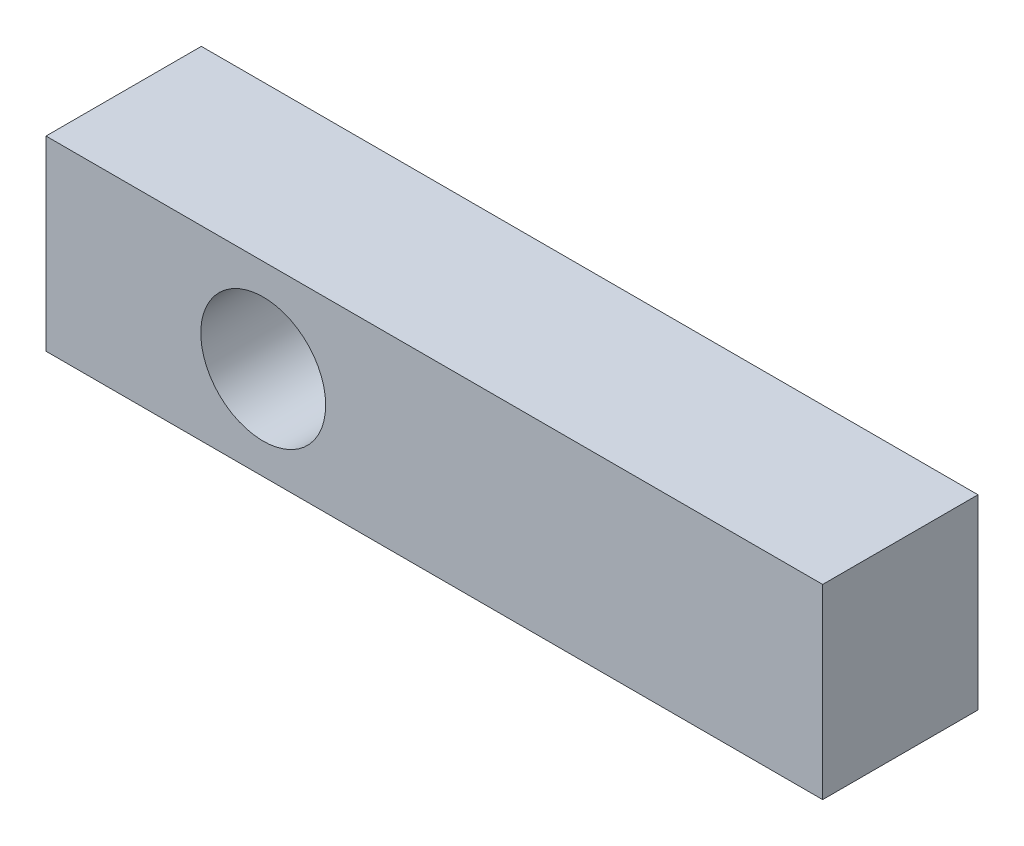
ISO-10303-21;
HEADER;
FILE_DESCRIPTION(('STEP AP214'),'2;1');
FILE_NAME('part.step','',(''),(''),'','','');
FILE_SCHEMA(('AUTOMOTIVE_DESIGN { 1 0 10303 214 1 1 1 1 }'));
ENDSEC;
DATA;
#1=APPLICATION_CONTEXT('core data for automotive mechanical design processes');
#2=APPLICATION_PROTOCOL_DEFINITION('international standard','automotive_design',2000,#1);
#3=PRODUCT_CONTEXT('',#1,'mechanical');
#4=PRODUCT('Part','Part','',(#3));
#5=PRODUCT_RELATED_PRODUCT_CATEGORY('part','',(#4));
#6=PRODUCT_DEFINITION_FORMATION('','',#4);
#7=PRODUCT_DEFINITION_CONTEXT('part definition',#1,'design');
#8=PRODUCT_DEFINITION('design','',#6,#7);
#9=PRODUCT_DEFINITION_SHAPE('','',#8);
#10=(LENGTH_UNIT() NAMED_UNIT(*) SI_UNIT(.MILLI.,.METRE.));
#11=(NAMED_UNIT(*) PLANE_ANGLE_UNIT() SI_UNIT($,.RADIAN.));
#12=(NAMED_UNIT(*) SI_UNIT($,.STERADIAN.) SOLID_ANGLE_UNIT());
#13=UNCERTAINTY_MEASURE_WITH_UNIT(LENGTH_MEASURE(1.E-05),#10,'distance_accuracy_value','');
#14=(GEOMETRIC_REPRESENTATION_CONTEXT(3) GLOBAL_UNCERTAINTY_ASSIGNED_CONTEXT((#13)) GLOBAL_UNIT_ASSIGNED_CONTEXT((#10,
#11,#12)) REPRESENTATION_CONTEXT('',''));
#15=CARTESIAN_POINT('',(0.,0.,0.));
#16=DIRECTION('',(0.,0.,1.));
#17=DIRECTION('',(1.,0.,0.));
#18=AXIS2_PLACEMENT_3D('',#15,#16,#17);
#19=CARTESIAN_POINT('',(12.5,-3.,5.));
#20=DIRECTION('',(-1.,0.,0.));
#21=DIRECTION('',(0.,0.,1.));
#22=AXIS2_PLACEMENT_3D('',#19,#20,#21);
#23=PLANE('',#22);
#24=DIRECTION('',(0.,1.,0.));
#25=VECTOR('',#24,1.);
#26=CARTESIAN_POINT('',(12.5,-3.,0.));
#27=LINE('',#26,#25);
#28=CARTESIAN_POINT('',(12.5,-3.,0.));
#29=VERTEX_POINT('',#28);
#30=CARTESIAN_POINT('',(12.5,3.,0.));
#31=VERTEX_POINT('',#30);
#32=EDGE_CURVE('E113',#29,#31,#27,.T.);
#33=ORIENTED_EDGE('',*,*,#32,.T.);
#34=DIRECTION('',(0.,0.,-1.));
#35=VECTOR('',#34,1.);
#36=CARTESIAN_POINT('',(12.5,3.,5.));
#37=LINE('',#36,#35);
#38=CARTESIAN_POINT('',(12.5,3.,5.));
#39=VERTEX_POINT('',#38);
#40=EDGE_CURVE('E11',#39,#31,#37,.T.);
#41=ORIENTED_EDGE('',*,*,#40,.F.);
#42=DIRECTION('',(0.,1.,0.));
#43=VECTOR('',#42,1.);
#44=CARTESIAN_POINT('',(12.5,-3.,5.));
#45=LINE('',#44,#43);
#46=CARTESIAN_POINT('',(12.5,-3.,5.));
#47=VERTEX_POINT('',#46);
#48=EDGE_CURVE('E97',#47,#39,#45,.T.);
#49=ORIENTED_EDGE('',*,*,#48,.F.);
#50=DIRECTION('',(0.,0.,-1.));
#51=VECTOR('',#50,1.);
#52=CARTESIAN_POINT('',(12.5,-3.,5.));
#53=LINE('',#52,#51);
#54=EDGE_CURVE('E109',#47,#29,#53,.T.);
#55=ORIENTED_EDGE('',*,*,#54,.T.);
#56=EDGE_LOOP('',(#33,#41,#49,#55));
#57=FACE_BOUND('',#56,.T.);
#58=ADVANCED_FACE('F45',(#57),#23,.F.);
#59=CARTESIAN_POINT('',(-12.5,3.,5.));
#60=DIRECTION('',(0.,-1.,0.));
#61=DIRECTION('',(0.,0.,-1.));
#62=AXIS2_PLACEMENT_3D('',#59,#60,#61);
#63=PLANE('',#62);
#64=DIRECTION('',(-1.,0.,0.));
#65=VECTOR('',#64,1.);
#66=CARTESIAN_POINT('',(-12.5,3.,0.));
#67=LINE('',#66,#65);
#68=CARTESIAN_POINT('',(-12.5,3.,0.));
#69=VERTEX_POINT('',#68);
#70=EDGE_CURVE('E102',#31,#69,#67,.T.);
#71=ORIENTED_EDGE('',*,*,#70,.T.);
#72=DIRECTION('',(0.,0.,-1.));
#73=VECTOR('',#72,1.);
#74=CARTESIAN_POINT('',(-12.5,3.,5.));
#75=LINE('',#74,#73);
#76=CARTESIAN_POINT('',(-12.5,3.,5.));
#77=VERTEX_POINT('',#76);
#78=EDGE_CURVE('E54',#77,#69,#75,.T.);
#79=ORIENTED_EDGE('',*,*,#78,.F.);
#80=DIRECTION('',(-1.,0.,0.));
#81=VECTOR('',#80,1.);
#82=CARTESIAN_POINT('',(-12.5,3.,5.));
#83=LINE('',#82,#81);
#84=EDGE_CURVE('E92',#39,#77,#83,.T.);
#85=ORIENTED_EDGE('',*,*,#84,.F.);
#86=ORIENTED_EDGE('',*,*,#40,.T.);
#87=EDGE_LOOP('',(#71,#79,#85,#86));
#88=FACE_BOUND('',#87,.T.);
#89=ADVANCED_FACE('F101',(#88),#63,.F.);
#90=CARTESIAN_POINT('',(-12.5,-3.,5.));
#91=DIRECTION('',(1.,0.,0.));
#92=DIRECTION('',(0.,0.,-1.));
#93=AXIS2_PLACEMENT_3D('',#90,#91,#92);
#94=PLANE('',#93);
#95=DIRECTION('',(0.,-1.,0.));
#96=VECTOR('',#95,1.);
#97=CARTESIAN_POINT('',(-12.5,-3.,0.));
#98=LINE('',#97,#96);
#99=CARTESIAN_POINT('',(-12.5,-3.,0.));
#100=VERTEX_POINT('',#99);
#101=EDGE_CURVE('E79',#69,#100,#98,.T.);
#102=ORIENTED_EDGE('',*,*,#101,.T.);
#103=DIRECTION('',(0.,0.,-1.));
#104=VECTOR('',#103,1.);
#105=CARTESIAN_POINT('',(-12.5,-3.,5.));
#106=LINE('',#105,#104);
#107=CARTESIAN_POINT('',(-12.5,-3.,5.));
#108=VERTEX_POINT('',#107);
#109=EDGE_CURVE('E104',#108,#100,#106,.T.);
#110=ORIENTED_EDGE('',*,*,#109,.F.);
#111=DIRECTION('',(0.,-1.,0.));
#112=VECTOR('',#111,1.);
#113=CARTESIAN_POINT('',(-12.5,-3.,5.));
#114=LINE('',#113,#112);
#115=EDGE_CURVE('E95',#77,#108,#114,.T.);
#116=ORIENTED_EDGE('',*,*,#115,.F.);
#117=ORIENTED_EDGE('',*,*,#78,.T.);
#118=EDGE_LOOP('',(#102,#110,#116,#117));
#119=FACE_BOUND('',#118,.T.);
#120=ADVANCED_FACE('F105',(#119),#94,.F.);
#121=CARTESIAN_POINT('',(-12.5,-3.,5.));
#122=DIRECTION('',(0.,1.,0.));
#123=DIRECTION('',(0.,0.,1.));
#124=AXIS2_PLACEMENT_3D('',#121,#122,#123);
#125=PLANE('',#124);
#126=DIRECTION('',(1.,0.,0.));
#127=VECTOR('',#126,1.);
#128=CARTESIAN_POINT('',(-12.5,-3.,0.));
#129=LINE('',#128,#127);
#130=EDGE_CURVE('E85',#100,#29,#129,.T.);
#131=ORIENTED_EDGE('',*,*,#130,.T.);
#132=ORIENTED_EDGE('',*,*,#54,.F.);
#133=DIRECTION('',(1.,0.,0.));
#134=VECTOR('',#133,1.);
#135=CARTESIAN_POINT('',(-12.5,-3.,5.));
#136=LINE('',#135,#134);
#137=EDGE_CURVE('E62',#108,#47,#136,.T.);
#138=ORIENTED_EDGE('',*,*,#137,.F.);
#139=ORIENTED_EDGE('',*,*,#109,.T.);
#140=EDGE_LOOP('',(#131,#132,#138,#139));
#141=FACE_BOUND('',#140,.T.);
#142=ADVANCED_FACE('F127',(#141),#125,.F.);
#143=CARTESIAN_POINT('',(0.,0.,5.));
#144=DIRECTION('',(0.,0.,-1.));
#145=DIRECTION('',(-1.,0.,0.));
#146=AXIS2_PLACEMENT_3D('',#143,#144,#145);
#147=PLANE('',#146);
#148=CARTESIAN_POINT('',(-5.5077958469531,0.,5.));
#149=DIRECTION('',(0.,0.,1.));
#150=DIRECTION('',(1.,0.,0.));
#151=AXIS2_PLACEMENT_3D('',#148,#149,#150);
#152=CIRCLE('',#151,2.01);
#153=CARTESIAN_POINT('',(-3.4977958469531,0.,5.));
#154=VERTEX_POINT('',#153);
#155=EDGE_CURVE('E134',#154,#154,#152,.T.);
#156=ORIENTED_EDGE('',*,*,#155,.F.);
#157=EDGE_LOOP('',(#156));
#158=FACE_BOUND('',#157,.T.);
#159=ORIENTED_EDGE('',*,*,#48,.T.);
#160=ORIENTED_EDGE('',*,*,#84,.T.);
#161=ORIENTED_EDGE('',*,*,#115,.T.);
#162=ORIENTED_EDGE('',*,*,#137,.T.);
#163=EDGE_LOOP('',(#159,#160,#161,#162));
#164=FACE_BOUND('',#163,.T.);
#165=ADVANCED_FACE('F93',(#158,#164),#147,.F.);
#166=CARTESIAN_POINT('',(0.,0.,0.));
#167=DIRECTION('',(0.,0.,-1.));
#168=DIRECTION('',(-1.,0.,0.));
#169=AXIS2_PLACEMENT_3D('',#166,#167,#168);
#170=PLANE('',#169);
#171=CARTESIAN_POINT('',(-5.5077958469531,0.,0.));
#172=DIRECTION('',(0.,0.,1.));
#173=DIRECTION('',(1.,0.,0.));
#174=AXIS2_PLACEMENT_3D('',#171,#172,#173);
#175=CIRCLE('',#174,2.01);
#176=CARTESIAN_POINT('',(-3.4977958469531,0.,0.));
#177=VERTEX_POINT('',#176);
#178=EDGE_CURVE('E117',#177,#177,#175,.T.);
#179=ORIENTED_EDGE('',*,*,#178,.T.);
#180=EDGE_LOOP('',(#179));
#181=FACE_BOUND('',#180,.T.);
#182=ORIENTED_EDGE('',*,*,#32,.F.);
#183=ORIENTED_EDGE('',*,*,#130,.F.);
#184=ORIENTED_EDGE('',*,*,#101,.F.);
#185=ORIENTED_EDGE('',*,*,#70,.F.);
#186=EDGE_LOOP('',(#182,#183,#184,#185));
#187=FACE_BOUND('',#186,.T.);
#188=ADVANCED_FACE('F130',(#181,#187),#170,.T.);
#189=CARTESIAN_POINT('',(-5.5077958469531,0.,0.));
#190=DIRECTION('',(0.,0.,1.));
#191=DIRECTION('',(1.,0.,0.));
#192=AXIS2_PLACEMENT_3D('',#189,#190,#191);
#193=CYLINDRICAL_SURFACE('',#192,2.01);
#194=ORIENTED_EDGE('',*,*,#178,.F.);
#195=EDGE_LOOP('',(#194));
#196=FACE_BOUND('',#195,.T.);
#197=ORIENTED_EDGE('',*,*,#155,.T.);
#198=EDGE_LOOP('',(#197));
#199=FACE_BOUND('',#198,.T.);
#200=ADVANCED_FACE('F143',(#196,#199),#193,.F.);
#201=CLOSED_SHELL('',(#58,#89,#120,#142,#165,#188,#200));
#202=MANIFOLD_SOLID_BREP('B2',#201);
#203=ADVANCED_BREP_SHAPE_REPRESENTATION('',(#18,#202),#14);
#204=SHAPE_DEFINITION_REPRESENTATION(#9,#203);
ENDSEC;
END-ISO-10303-21;
